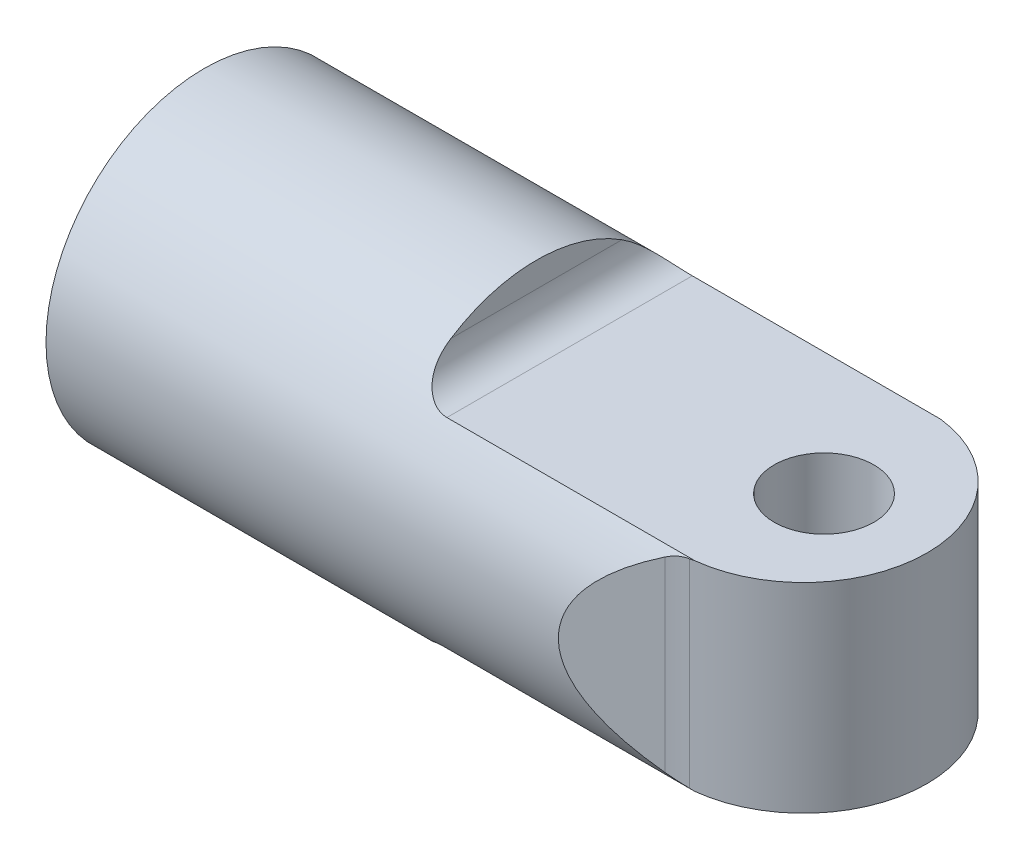
ISO-10303-21;
HEADER;
FILE_DESCRIPTION(('STEP AP214'),'2;1');
FILE_NAME('part.step','',(''),(''),'','','');
FILE_SCHEMA(('AUTOMOTIVE_DESIGN { 1 0 10303 214 1 1 1 1 }'));
ENDSEC;
DATA;
#1=APPLICATION_CONTEXT('core data for automotive mechanical design processes');
#2=APPLICATION_PROTOCOL_DEFINITION('international standard','automotive_design',2000,#1);
#3=PRODUCT_CONTEXT('',#1,'mechanical');
#4=PRODUCT('Part','Part','',(#3));
#5=PRODUCT_RELATED_PRODUCT_CATEGORY('part','',(#4));
#6=PRODUCT_DEFINITION_FORMATION('','',#4);
#7=PRODUCT_DEFINITION_CONTEXT('part definition',#1,'design');
#8=PRODUCT_DEFINITION('design','',#6,#7);
#9=PRODUCT_DEFINITION_SHAPE('','',#8);
#10=(LENGTH_UNIT() NAMED_UNIT(*) SI_UNIT(.MILLI.,.METRE.));
#11=(NAMED_UNIT(*) PLANE_ANGLE_UNIT() SI_UNIT($,.RADIAN.));
#12=(NAMED_UNIT(*) SI_UNIT($,.STERADIAN.) SOLID_ANGLE_UNIT());
#13=UNCERTAINTY_MEASURE_WITH_UNIT(LENGTH_MEASURE(1.E-05),#10,'distance_accuracy_value','');
#14=(GEOMETRIC_REPRESENTATION_CONTEXT(3) GLOBAL_UNCERTAINTY_ASSIGNED_CONTEXT((#13)) GLOBAL_UNIT_ASSIGNED_CONTEXT((#10,
#11,#12)) REPRESENTATION_CONTEXT('',''));
#15=CARTESIAN_POINT('',(0.,0.,0.));
#16=DIRECTION('',(0.,0.,1.));
#17=DIRECTION('',(1.,0.,0.));
#18=AXIS2_PLACEMENT_3D('',#15,#16,#17);
#19=CARTESIAN_POINT('',(-78.7533614327049,-133.755821716633,0.));
#20=DIRECTION('',(0.,1.,0.));
#21=DIRECTION('',(0.,0.,1.));
#22=AXIS2_PLACEMENT_3D('',#19,#20,#21);
#23=CYLINDRICAL_SURFACE('',#22,38.1);
#24=CARTESIAN_POINT('',(-78.7533614327049,-76.4076160114484,0.));
#25=DIRECTION('',(0.,1.,0.));
#26=DIRECTION('',(0.,0.,1.));
#27=AXIS2_PLACEMENT_3D('',#24,#25,#26);
#28=CIRCLE('',#27,38.1);
#29=CARTESIAN_POINT('',(-78.7533614327049,-76.4076160114485,38.1));
#30=VERTEX_POINT('',#29);
#31=EDGE_CURVE('E261',#30,#30,#28,.F.);
#32=ORIENTED_EDGE('',*,*,#31,.T.);
#33=EDGE_LOOP('',(#32));
#34=FACE_BOUND('',#33,.T.);
#35=CARTESIAN_POINT('',(-78.753361432705,76.4076160114479,0.));
#36=DIRECTION('',(0.,1.,0.));
#37=DIRECTION('',(0.,0.,1.));
#38=AXIS2_PLACEMENT_3D('',#35,#36,#37);
#39=CIRCLE('',#38,38.1);
#40=CARTESIAN_POINT('',(-78.753361432705,76.4076160114479,38.1000000000001));
#41=VERTEX_POINT('',#40);
#42=EDGE_CURVE('E19',#41,#41,#39,.T.);
#43=ORIENTED_EDGE('',*,*,#42,.T.);
#44=EDGE_LOOP('',(#43));
#45=FACE_BOUND('',#44,.T.);
#46=ADVANCED_FACE('F16',(#34,#45),#23,.F.);
#47=CARTESIAN_POINT('',(-94.485801667644,122.982158002432,94.4858016676441));
#48=DIRECTION('',(-0.371053816889971,0.,-0.928611363796171));
#49=DIRECTION('',(-0.928611363796171,0.,0.371053816889971));
#50=AXIS2_PLACEMENT_3D('',#47,#48,#49);
#51=PLANE('',#50);
#52=CARTESIAN_POINT('',(141.977442077894,0.,0.));
#53=DIRECTION('',(-0.371053816889971,0.,-0.928611363796171));
#54=DIRECTION('',(-0.928611363796171,0.,0.371053816889971));
#55=AXIS2_PLACEMENT_3D('',#52,#53,#54);
#56=ELLIPSE('',#55,326.155068974868,121.021083241137);
#57=CARTESIAN_POINT('',(-102.560386988729,-71.4032287721533,97.7122382804206));
#58=VERTEX_POINT('',#57);
#59=CARTESIAN_POINT('',(-102.560386988856,71.4032287720838,97.7122382804714));
#60=VERTEX_POINT('',#59);
#61=EDGE_CURVE('E113',#58,#60,#56,.T.);
#62=ORIENTED_EDGE('',*,*,#61,.F.);
#63=DIRECTION('',(0.,-1.,0.));
#64=VECTOR('',#63,1.);
#65=CARTESIAN_POINT('',(-102.560385620926,122.982158002432,97.7122377338751));
#66=LINE('',#65,#64);
#67=EDGE_CURVE('E109',#60,#58,#66,.T.);
#68=ORIENTED_EDGE('',*,*,#67,.F.);
#69=EDGE_LOOP('',(#62,#68));
#70=FACE_BOUND('',#69,.T.);
#71=ADVANCED_FACE('F240',(#70),#51,.F.);
#72=CARTESIAN_POINT('',(-83.7108517229156,76.8513540198977,144.885695014721));
#73=DIRECTION('',(0.,-1.,0.));
#74=DIRECTION('',(0.,0.,-1.));
#75=AXIS2_PLACEMENT_3D('',#72,#73,#74);
#76=CYLINDRICAL_SURFACE('',#75,50.8);
#77=CARTESIAN_POINT('',(-87.4784240785286,-75.944974900852,94.2255983048049));
#78=CARTESIAN_POINT('',(-87.9591413138485,-75.9006257665468,94.2613360229051));
#79=CARTESIAN_POINT('',(-88.4385572819601,-75.8477822609244,94.3038828844457));
#80=CARTESIAN_POINT('',(-89.39384238822,-75.7252672582749,94.4022935245304));
#81=CARTESIAN_POINT('',(-89.8697116555395,-75.6555963772198,94.4581568156211));
#82=CARTESIAN_POINT('',(-90.8169268680687,-75.4995952256391,94.5828927132073));
#83=CARTESIAN_POINT('',(-91.2882734484359,-75.4132673314315,94.6517634640069));
#84=CARTESIAN_POINT('',(-92.2255909509754,-75.2241677058967,94.8021188419887));
#85=CARTESIAN_POINT('',(-92.6915618919484,-75.1213960320988,94.883603425041));
#86=CARTESIAN_POINT('',(-94.0622717602115,-74.7930442517556,95.1429468445752));
#87=CARTESIAN_POINT('',(-94.958347650339,-74.5443546069871,95.3381705767435));
#88=CARTESIAN_POINT('',(-96.7205356721103,-73.9868944374089,95.771427332384));
#89=CARTESIAN_POINT('',(-97.5866583441609,-73.6781453059397,96.0094451102297));
#90=CARTESIAN_POINT('',(-98.7906209236783,-73.1995510972479,96.3740616254773));
#91=CARTESIAN_POINT('',(-99.1428352440458,-73.0533111551811,96.4849841586253));
#92=CARTESIAN_POINT('',(-99.8408804877988,-72.7510186093603,96.7131208459379));
#93=CARTESIAN_POINT('',(-100.186712842788,-72.5949682417619,96.8303335654533));
#94=CARTESIAN_POINT('',(-100.874607878274,-72.2719261711436,97.0716861797085));
#95=CARTESIAN_POINT('',(-101.216615669623,-72.1048546018898,97.1958753779656));
#96=CARTESIAN_POINT('',(-101.89374433525,-71.7611483850489,97.4499145585377));
#97=CARTESIAN_POINT('',(-102.228863893979,-71.5845119336988,97.5797656076692));
#98=CARTESIAN_POINT('',(-102.560388285121,-71.4032280632773,97.7122387984318));
#99=B_SPLINE_CURVE_WITH_KNOTS('',3,(#77,#78,#79,#80,#81,#82,#83,#84,#85,#86,#87,#88,#89,#90,#91,
#92,#93,#94,#95,#96,#97,#98),.UNSPECIFIED.,.F.,.F.,(4,2,2,2,2,2,2,2,2,2,4),(0.,1.45209674884003,
2.90414035121641,4.35597695552534,5.80780848063729,8.65480281851505,11.5007849006894,
12.6921294118824,13.8832033497035,15.0841351813231,16.2852942809736),.UNSPECIFIED.);
#100=CARTESIAN_POINT('',(-87.4780646619713,-75.9420063889409,94.226748249264));
#101=VERTEX_POINT('',#100);
#102=EDGE_CURVE('E107',#101,#58,#99,.T.);
#103=ORIENTED_EDGE('',*,*,#102,.F.);
#104=DIRECTION('',(0.,-1.,0.));
#105=VECTOR('',#104,1.);
#106=CARTESIAN_POINT('',(-87.4783737444027,76.8513540198977,94.2255945626131));
#107=LINE('',#106,#105);
#108=CARTESIAN_POINT('',(-87.4780646619712,75.9420063889409,94.226748249264));
#109=VERTEX_POINT('',#108);
#110=EDGE_CURVE('E93',#101,#109,#107,.F.);
#111=ORIENTED_EDGE('',*,*,#110,.T.);
#112=CARTESIAN_POINT('',(-102.56038828512,71.4032280632772,97.7122387984319));
#113=CARTESIAN_POINT('',(-102.159650652368,71.622363206644,97.5521056677623));
#114=CARTESIAN_POINT('',(-101.75365180511,71.834705991839,97.3958053574022));
#115=CARTESIAN_POINT('',(-100.931527491984,72.2454070592024,97.0915499607565));
#116=CARTESIAN_POINT('',(-100.515401052284,72.4437639893367,96.9435956815704));
#117=CARTESIAN_POINT('',(-99.673076957373,72.8262408670006,96.6566007143807));
#118=CARTESIAN_POINT('',(-99.2468697130204,73.010346483601,96.5175690222146));
#119=CARTESIAN_POINT('',(-98.3853665489854,73.3636870755646,96.2492659236802));
#120=CARTESIAN_POINT('',(-97.9500709876938,73.5329226359512,96.1199941333624));
#121=CARTESIAN_POINT('',(-96.6492306272991,74.0112021646822,95.752828397991));
#122=CARTESIAN_POINT('',(-95.7714169298378,74.2986764412095,95.5296570479446));
#123=CARTESIAN_POINT('',(-93.9887191625616,74.8123935047922,95.1278871893943));
#124=CARTESIAN_POINT('',(-93.0838551162858,75.0386803964948,94.9492565826246));
#125=CARTESIAN_POINT('',(-91.7855077298466,75.3149074781091,94.7300265068767));
#126=CARTESIAN_POINT('',(-91.4006917617102,75.3908660861876,94.6695725403067));
#127=CARTESIAN_POINT('',(-90.6278150046957,75.5316422087525,94.5572935368821));
#128=CARTESIAN_POINT('',(-90.2397547356426,75.5964614735007,94.5054671444659));
#129=CARTESIAN_POINT('',(-89.4575006600138,75.7153682659288,94.4102297611909));
#130=CARTESIAN_POINT('',(-89.0632828133874,75.7693585454265,94.366895102514));
#131=CARTESIAN_POINT('',(-88.2724807178992,75.8658268432016,94.2893555427669));
#132=CARTESIAN_POINT('',(-87.8758960863949,75.9083029454348,94.2551521612231));
#133=CARTESIAN_POINT('',(-87.4784240784264,75.9449749012491,94.2255983059104));
#134=B_SPLINE_CURVE_WITH_KNOTS('',3,(#112,#113,#114,#115,#116,#117,#118,#119,#120,#121,#122,
#123,#124,#125,#126,#127,#128,#129,#130,#131,#132,#133),.UNSPECIFIED.,.F.,.F.,(4,2,2,2,2,2,2,2,
2,2,4),(0.,1.45191794594972,2.90397605915543,4.35747586915737,5.81091846938353,8.65823789429381,
11.5034994305381,12.6939127911857,13.8841389375927,15.0846172244154,16.2852951572362),.UNSPECIFIED.);
#135=EDGE_CURVE('E249',#60,#109,#134,.T.);
#136=ORIENTED_EDGE('',*,*,#135,.F.);
#137=ORIENTED_EDGE('',*,*,#67,.T.);
#138=EDGE_LOOP('',(#103,#111,#136,#137));
#139=FACE_BOUND('',#138,.T.);
#140=ADVANCED_FACE('F108',(#139),#76,.F.);
#141=CARTESIAN_POINT('',(-298.708582290545,127.239678051438,-128.982810471636));
#142=DIRECTION('',(-1.,0.,0.));
#143=DIRECTION('',(0.,-1.,0.));
#144=AXIS2_PLACEMENT_3D('',#141,#142,#143);
#145=PLANE('',#144);
#146=DIRECTION('',(0.,0.,-1.));
#147=VECTOR('',#146,1.);
#148=CARTESIAN_POINT('',(-298.708582290545,101.807616011448,-128.982810471636));
#149=LINE('',#148,#147);
#150=CARTESIAN_POINT('',(-298.708582290545,101.807616011448,65.4317347387616));
#151=VERTEX_POINT('',#150);
#152=CARTESIAN_POINT('',(-298.708582290545,101.807616011448,-65.4317347387619));
#153=VERTEX_POINT('',#152);
#154=EDGE_CURVE('E265',#151,#153,#149,.T.);
#155=ORIENTED_EDGE('',*,*,#154,.T.);
#156=CARTESIAN_POINT('',(-298.708582290545,0.,0.));
#157=DIRECTION('',(-1.,0.,0.));
#158=DIRECTION('',(0.,-1.,0.));
#159=AXIS2_PLACEMENT_3D('',#156,#157,#158);
#160=CIRCLE('',#159,121.021083241137);
#161=EDGE_CURVE('E253',#151,#153,#160,.T.);
#162=ORIENTED_EDGE('',*,*,#161,.F.);
#163=EDGE_LOOP('',(#155,#162));
#164=FACE_BOUND('',#163,.T.);
#165=ADVANCED_FACE('F233',(#164),#145,.F.);
#166=CARTESIAN_POINT('',(-273.308582290545,101.807616011448,-128.982810471636));
#167=DIRECTION('',(0.,0.,-1.));
#168=DIRECTION('',(0.,1.,0.));
#169=AXIS2_PLACEMENT_3D('',#166,#167,#168);
#170=CYLINDRICAL_SURFACE('',#169,25.4);
#171=DIRECTION('',(0.,0.,-1.));
#172=VECTOR('',#171,1.);
#173=CARTESIAN_POINT('',(-273.308582290545,76.4076160114481,-128.982810471636));
#174=LINE('',#173,#172);
#175=CARTESIAN_POINT('',(-273.308582290545,76.4076160114484,93.8508327310164));
#176=VERTEX_POINT('',#175);
#177=CARTESIAN_POINT('',(-273.308582290545,76.4076160114481,-93.8508327310166));
#178=VERTEX_POINT('',#177);
#179=EDGE_CURVE('E263',#176,#178,#174,.T.);
#180=ORIENTED_EDGE('',*,*,#179,.T.);
#181=CARTESIAN_POINT('',(-298.708582290545,101.807616011448,-65.4317347387618));
#182=CARTESIAN_POINT('',(-298.708553295663,101.362039777198,-66.1250504055652));
#183=CARTESIAN_POINT('',(-298.696854430139,100.909313064868,-66.8138666988336));
#184=CARTESIAN_POINT('',(-298.647667865774,99.9901907666376,-68.1816877285484));
#185=CARTESIAN_POINT('',(-298.610171964879,99.5237908785789,-68.860689274315));
#186=CARTESIAN_POINT('',(-298.506688220139,98.5759404299829,-70.2108995881486));
#187=CARTESIAN_POINT('',(-298.440562752541,98.094427724943,-70.8820544258446));
#188=CARTESIAN_POINT('',(-298.277108670187,97.1196606727773,-72.2118659429244));
#189=CARTESIAN_POINT('',(-298.179782944182,96.6264074165912,-72.870523773396));
#190=CARTESIAN_POINT('',(-297.949330065795,95.6218978773581,-74.1838866379355));
#191=CARTESIAN_POINT('',(-297.815680220376,95.1104818186196,-74.8383786843259));
#192=CARTESIAN_POINT('',(-297.510101610844,94.0787110533906,-76.1313522416565));
#193=CARTESIAN_POINT('',(-297.338169343638,93.5583555329046,-76.7698322814404));
#194=CARTESIAN_POINT('',(-296.953127554107,92.5121590730919,-78.0273703835272));
#195=CARTESIAN_POINT('',(-296.740104341319,91.9863317795471,-78.6464660480018));
#196=CARTESIAN_POINT('',(-296.269336262037,90.9311533730512,-79.864113980488));
#197=CARTESIAN_POINT('',(-296.011603148997,90.4018032212798,-80.4626715981846));
#198=CARTESIAN_POINT('',(-295.450783090263,89.3482631676742,-81.6308941350272));
#199=CARTESIAN_POINT('',(-295.148171568464,88.8240741836223,-82.2007868188502));
#200=CARTESIAN_POINT('',(-294.492565328531,87.7798227150583,-83.3149947720718));
#201=CARTESIAN_POINT('',(-294.13956706132,87.2597605239501,-83.8593082361616));
#202=CARTESIAN_POINT('',(-293.381865034104,86.2310477169368,-84.9167262725819));
#203=CARTESIAN_POINT('',(-292.977390337051,85.7223576215602,-85.4299550768628));
#204=CARTESIAN_POINT('',(-292.329469593399,84.9708930746832,-86.1752556926351));
#205=CARTESIAN_POINT('',(-292.10663856995,84.7223439699595,-86.4195886238046));
#206=CARTESIAN_POINT('',(-291.646925211521,84.2298262371915,-86.8996963323589));
#207=CARTESIAN_POINT('',(-291.410039210303,83.9858588263237,-87.1354688506797));
#208=CARTESIAN_POINT('',(-290.750233010766,83.3335635361514,-87.760718545422));
#209=CARTESIAN_POINT('',(-290.313771487769,82.9304670711565,-88.1415242702583));
#210=CARTESIAN_POINT('',(-289.399441423806,82.1452840919702,-88.8737483288823));
#211=CARTESIAN_POINT('',(-288.92158163429,81.7631931650621,-89.2251728430383));
#212=CARTESIAN_POINT('',(-287.924688322623,81.025072424224,-89.8959898985018));
#213=CARTESIAN_POINT('',(-287.405647169774,80.6690474637947,-90.2153764784008));
#214=CARTESIAN_POINT('',(-286.327885895314,79.9887339793915,-90.8191164151133));
#215=CARTESIAN_POINT('',(-285.769172267049,79.6644402824072,-91.1034754842735));
#216=CARTESIAN_POINT('',(-284.702656675659,79.0998733417904,-91.5938338730953));
#217=CARTESIAN_POINT('',(-284.20009006539,78.8543295573354,-91.8051695222732));
#218=CARTESIAN_POINT('',(-283.170366861765,78.3934477499004,-92.1990339279871));
#219=CARTESIAN_POINT('',(-282.643211413362,78.1781083223538,-92.3815640240917));
#220=CARTESIAN_POINT('',(-281.567750469749,77.7810821431823,-92.716089296299));
#221=CARTESIAN_POINT('',(-281.01947128259,77.5993550688267,-92.8681210781789));
#222=CARTESIAN_POINT('',(-279.904576091401,77.2721275619151,-93.1405728670207));
#223=CARTESIAN_POINT('',(-279.337963178696,77.1266210576595,-93.2609981724001));
#224=CARTESIAN_POINT('',(-278.321638708202,76.9031035870267,-93.445337371712));
#225=CARTESIAN_POINT('',(-277.874823996466,76.8172669432001,-93.5158766997475));
#226=CARTESIAN_POINT('',(-276.974670818573,76.669442869871,-93.6371095607308));
#227=CARTESIAN_POINT('',(-276.521333566468,76.6074510601666,-93.6878067386334));
#228=CARTESIAN_POINT('',(-275.60927668063,76.5078609876929,-93.7691525134342));
#229=CARTESIAN_POINT('',(-275.150548411725,76.4703096010725,-93.799762584663));
#230=CARTESIAN_POINT('',(-274.460766093168,76.4327155025007,-93.8303938628335));
#231=CARTESIAN_POINT('',(-274.230505165862,76.4233062921752,-93.8380569873293));
#232=CARTESIAN_POINT('',(-273.769696669172,76.4107559140037,-93.848276518847));
#233=CARTESIAN_POINT('',(-273.539149096439,76.4076148200792,-93.8508328656436));
#234=CARTESIAN_POINT('',(-273.308582290545,76.4076160114481,-93.8508327310166));
#235=B_SPLINE_CURVE_WITH_KNOTS('',3,(#181,#182,#183,#184,#185,#186,#187,#188,#189,#190,#191,
#192,#193,#194,#195,#196,#197,#198,#199,#200,#201,#202,#203,#204,#205,#206,#207,#208,#209,#210,
#211,#212,#213,#214,#215,#216,#217,#218,#219,#220,#221,#222,#223,#224,#225,#226,#227,#228,#229,
#230,#231,#232,#233,#234),.UNSPECIFIED.,.F.,.F.,(4,2,2,2,2,2,2,2,2,2,2,2,2,2,2,2,2,2,2,2,2,2,2,
2,2,2,4),(0.,2.47244767678368,4.94568182082443,7.43093927239429,9.91596668686305,
12.4388419995297,14.9619482667477,17.4798114720274,19.9970137751915,22.4892378856576,
24.9816376268872,27.4633108342745,28.7040386346589,29.9450915136756,32.0600328469734,
34.174528174926,36.2894162272692,38.403958922113,40.1959312811609,41.987820282047,
43.7775455173895,45.5669705365047,46.9472013543143,48.3271785079403,49.7097946855419,
50.401413092254,51.0930396553331),.UNSPECIFIED.);
#236=EDGE_CURVE('E154',#153,#178,#235,.T.);
#237=ORIENTED_EDGE('',*,*,#236,.F.);
#238=ORIENTED_EDGE('',*,*,#154,.F.);
#239=CARTESIAN_POINT('',(-273.308582290545,76.4076160114484,93.8508327310164));
#240=CARTESIAN_POINT('',(-273.603081038692,76.40761299536,93.8508329641864));
#241=CARTESIAN_POINT('',(-273.897539126936,76.4127391461998,93.8466620644234));
#242=CARTESIAN_POINT('',(-274.48585216948,76.4332064606894,93.8299940944429));
#243=CARTESIAN_POINT('',(-274.779707147867,76.4485472080828,93.8174973635127));
#244=CARTESIAN_POINT('',(-275.659261599661,76.5098019831983,93.7675624464351));
#245=CARTESIAN_POINT('',(-276.243312472323,76.5709486533712,93.7176794910539));
#246=CARTESIAN_POINT('',(-277.399036216295,76.7323882007583,93.5855432953099));
#247=CARTESIAN_POINT('',(-277.970757506843,76.8324768316122,93.5034589295498));
#248=CARTESIAN_POINT('',(-279.100868156554,77.0701386490444,93.30766307369));
#249=CARTESIAN_POINT('',(-279.659256860031,77.2077136750606,93.193950031582));
#250=CARTESIAN_POINT('',(-280.758169428881,77.5179205068891,92.9360810827387));
#251=CARTESIAN_POINT('',(-281.298714293842,77.6905092623254,92.7919625518095));
#252=CARTESIAN_POINT('',(-282.359512241968,78.0682476767616,92.4743862337378));
#253=CARTESIAN_POINT('',(-282.879763581674,78.2734001257336,92.3009259325854));
#254=CARTESIAN_POINT('',(-283.642974860045,78.6033627014609,92.0197525114579));
#255=CARTESIAN_POINT('',(-283.894672040599,78.7171352063467,91.9224624123145));
#256=CARTESIAN_POINT('',(-284.391941017831,78.9516605815279,91.7211086437738));
#257=CARTESIAN_POINT('',(-284.637514443951,79.0724115659586,91.6170468034233));
#258=CARTESIAN_POINT('',(-285.364812617127,79.4446140063685,91.2949260979241));
#259=CARTESIAN_POINT('',(-285.837128186459,79.7060205667131,91.0669272764397));
#260=CARTESIAN_POINT('',(-286.778727543037,80.2662413323865,90.5736137162794));
#261=CARTESIAN_POINT('',(-287.246574418789,80.5662943063451,90.3069745069433));
#262=CARTESIAN_POINT('',(-288.151335452718,81.1883512355863,89.7481420575206));
#263=CARTESIAN_POINT('',(-288.58824933761,81.5103553847538,89.4559485917183));
#264=CARTESIAN_POINT('',(-289.430267689676,82.1724954839315,88.8481026443759));
#265=CARTESIAN_POINT('',(-289.835391377403,82.5126202659362,88.5324645658624));
#266=CARTESIAN_POINT('',(-290.614078807363,83.2078219094289,87.879398416021));
#267=CARTESIAN_POINT('',(-290.987635913863,83.562901891317,87.5419657893494));
#268=CARTESIAN_POINT('',(-291.889358492795,84.4723592623864,86.666611283029));
#269=CARTESIAN_POINT('',(-292.397084660988,85.0344842243164,86.1155647895054));
#270=CARTESIAN_POINT('',(-293.34276597524,86.1761889173559,84.9730548155954));
#271=CARTESIAN_POINT('',(-293.780690594586,86.7557761543101,84.3815738124505));
#272=CARTESIAN_POINT('',(-294.592774722838,87.9276158402001,83.1598328407098));
#273=CARTESIAN_POINT('',(-294.966528991863,88.5199239786689,82.5293583396955));
#274=CARTESIAN_POINT('',(-295.651371606911,89.7068218763551,81.2376634240358));
#275=CARTESIAN_POINT('',(-295.962468035352,90.3014113312025,80.5764469884439));
#276=CARTESIAN_POINT('',(-296.476106284005,91.3809155588567,79.3484361749662));
#277=CARTESIAN_POINT('',(-296.688109829912,91.866351808291,78.7860076620069));
#278=CARTESIAN_POINT('',(-297.07586002171,92.8327824988531,77.6449360211718));
#279=CARTESIAN_POINT('',(-297.251600892177,93.313776220801,77.0662903270882));
#280=CARTESIAN_POINT('',(-297.569589810285,94.2698661685469,75.8937942200645));
#281=CARTESIAN_POINT('',(-297.711792286861,94.7449535485996,75.2999243210919));
#282=CARTESIAN_POINT('',(-297.964931818672,95.6869701159928,74.099181448789));
#283=CARTESIAN_POINT('',(-298.075867169254,96.1538988572307,73.4923077684448));
#284=CARTESIAN_POINT('',(-298.267169624504,97.0701011908938,72.2777040403788));
#285=CARTESIAN_POINT('',(-298.348041603068,97.5195409336226,71.6701780814507));
#286=CARTESIAN_POINT('',(-298.484100193379,98.4082946990197,70.4448935321954));
#287=CARTESIAN_POINT('',(-298.53928511385,98.8476080531414,69.8271342708641));
#288=CARTESIAN_POINT('',(-298.625864451481,99.7137921852255,68.5845007115305));
#289=CARTESIAN_POINT('',(-298.657339785021,100.140700458327,67.9596580686212));
#290=CARTESIAN_POINT('',(-298.698685893533,100.982950800582,66.7017219162888));
#291=CARTESIAN_POINT('',(-298.708561739758,101.398295562069,66.068630378712));
#292=CARTESIAN_POINT('',(-298.708582290545,101.807616011448,65.4317347387617));
#293=B_SPLINE_CURVE_WITH_KNOTS('',3,(#239,#240,#241,#242,#243,#244,#245,#246,#247,#248,#249,
#250,#251,#252,#253,#254,#255,#256,#257,#258,#259,#260,#261,#262,#263,#264,#265,#266,#267,#268,
#269,#270,#271,#272,#273,#274,#275,#276,#277,#278,#279,#280,#281,#282,#283,#284,#285,#286,#287,
#288,#289,#290,#291,#292),.UNSPECIFIED.,.F.,.F.,(4,2,2,2,2,2,2,2,2,2,2,2,2,2,2,2,2,2,2,2,2,2,2,
2,2,2,4),(0.,0.883341381448317,1.76664676792536,3.53217582577983,5.28856706385273,
7.04504450265367,8.7993752504606,10.5538563859529,11.4322132686715,12.3103338841536,
14.0665305950196,15.9141208146322,17.7617273553004,19.6082080738518,21.4550759876611,
24.2609381476654,27.0680240643292,29.8922322923756,32.7160759838436,35.0328409707771,
37.349974656045,39.6702388911982,41.9906296005544,44.2700738402254,46.549668140821,
48.8214469188083,51.0926922580234),.UNSPECIFIED.);
#294=EDGE_CURVE('E164',#176,#151,#293,.T.);
#295=ORIENTED_EDGE('',*,*,#294,.F.);
#296=EDGE_LOOP('',(#180,#237,#238,#295));
#297=FACE_BOUND('',#296,.T.);
#298=ADVANCED_FACE('F228',(#297),#170,.F.);
#299=CARTESIAN_POINT('',(-273.308582290545,76.4076160114481,-128.982810471636));
#300=DIRECTION('',(0.,-1.,0.));
#301=DIRECTION('',(0.,0.,-1.));
#302=AXIS2_PLACEMENT_3D('',#299,#300,#301);
#303=PLANE('',#302);
#304=ORIENTED_EDGE('',*,*,#42,.F.);
#305=EDGE_LOOP('',(#304));
#306=FACE_BOUND('',#305,.T.);
#307=DIRECTION('',(-1.,0.,0.));
#308=VECTOR('',#307,1.);
#309=CARTESIAN_POINT('',(-298.708582290546,76.4076160114481,-93.8508327310166));
#310=LINE('',#309,#308);
#311=CARTESIAN_POINT('',(-83.5501758294894,76.4076160114484,-93.8508327310166));
#312=VERTEX_POINT('',#311);
#313=EDGE_CURVE('E255',#178,#312,#310,.F.);
#314=ORIENTED_EDGE('',*,*,#313,.F.);
#315=ORIENTED_EDGE('',*,*,#179,.F.);
#316=DIRECTION('',(-1.,0.,0.));
#317=VECTOR('',#316,1.);
#318=CARTESIAN_POINT('',(-298.708582290546,76.4076160114484,93.8508327310163));
#319=LINE('',#318,#317);
#320=CARTESIAN_POINT('',(-83.5501758294871,76.4076160114484,93.8508327310163));
#321=VERTEX_POINT('',#320);
#322=EDGE_CURVE('E250',#321,#176,#319,.T.);
#323=ORIENTED_EDGE('',*,*,#322,.F.);
#324=CARTESIAN_POINT('',(-94.4858016676441,76.4076160114485,0.));
#325=DIRECTION('',(0.,-1.,0.));
#326=DIRECTION('',(0.,0.,-1.));
#327=AXIS2_PLACEMENT_3D('',#324,#325,#326);
#328=CIRCLE('',#327,94.4858016676441);
#329=EDGE_CURVE('E85',#321,#312,#328,.F.);
#330=ORIENTED_EDGE('',*,*,#329,.T.);
#331=EDGE_LOOP('',(#314,#315,#323,#330));
#332=FACE_BOUND('',#331,.T.);
#333=ADVANCED_FACE('F225',(#306,#332),#303,.F.);
#334=CARTESIAN_POINT('',(-167.800518605271,122.982158002432,-123.780840059922));
#335=DIRECTION('',(-0.371053816889971,0.,0.92861136379617));
#336=DIRECTION('',(0.92861136379617,0.,0.371053816889971));
#337=AXIS2_PLACEMENT_3D('',#334,#335,#336);
#338=PLANE('',#337);
#339=CARTESIAN_POINT('',(141.977442077894,0.,0.));
#340=DIRECTION('',(-0.371053816889971,0.,0.92861136379617));
#341=DIRECTION('',(-0.92861136379617,0.,-0.371053816889971));
#342=AXIS2_PLACEMENT_3D('',#339,#340,#341);
#343=ELLIPSE('',#342,326.155068974868,121.021083241137);
#344=CARTESIAN_POINT('',(-102.560386988729,71.4032287721531,-97.7122382804207));
#345=VERTEX_POINT('',#344);
#346=CARTESIAN_POINT('',(-102.560386988856,-71.4032287720837,-97.7122382804714));
#347=VERTEX_POINT('',#346);
#348=EDGE_CURVE('E276',#345,#347,#343,.T.);
#349=ORIENTED_EDGE('',*,*,#348,.F.);
#350=DIRECTION('',(0.,-1.,0.));
#351=VECTOR('',#350,1.);
#352=CARTESIAN_POINT('',(-102.560385620926,122.982158002432,-97.712237733875));
#353=LINE('',#352,#351);
#354=EDGE_CURVE('E104',#347,#345,#353,.F.);
#355=ORIENTED_EDGE('',*,*,#354,.F.);
#356=EDGE_LOOP('',(#349,#355));
#357=FACE_BOUND('',#356,.T.);
#358=ADVANCED_FACE('F220',(#357),#338,.F.);
#359=CARTESIAN_POINT('',(-83.7108517229152,76.8513540198979,-144.88569501472));
#360=DIRECTION('',(0.,-1.,0.));
#361=DIRECTION('',(0.,0.,-1.));
#362=AXIS2_PLACEMENT_3D('',#359,#360,#361);
#363=CYLINDRICAL_SURFACE('',#362,50.8);
#364=CARTESIAN_POINT('',(-102.56038828512,-71.4032280632771,-97.712238798432));
#365=CARTESIAN_POINT('',(-102.159650652368,-71.6223632066439,-97.5521056677624));
#366=CARTESIAN_POINT('',(-101.75365180511,-71.8347059918388,-97.3958053574023));
#367=CARTESIAN_POINT('',(-100.931527491984,-72.2454070592023,-97.0915499607566));
#368=CARTESIAN_POINT('',(-100.515401052284,-72.4437639893366,-96.9435956815706));
#369=CARTESIAN_POINT('',(-99.673076957373,-72.8262408670005,-96.6566007143808));
#370=CARTESIAN_POINT('',(-99.2468697130204,-73.0103464836009,-96.5175690222147));
#371=CARTESIAN_POINT('',(-98.3853665489854,-73.3636870755645,-96.2492659236803));
#372=CARTESIAN_POINT('',(-97.9500709876938,-73.5329226359512,-96.1199941333625));
#373=CARTESIAN_POINT('',(-96.649230627299,-74.0112021646822,-95.7528283979911));
#374=CARTESIAN_POINT('',(-95.7714169298377,-74.2986764412094,-95.5296570479447));
#375=CARTESIAN_POINT('',(-93.9887191625616,-74.8123935047921,-95.1278871893944));
#376=CARTESIAN_POINT('',(-93.0838551162858,-75.0386803964949,-94.9492565826247));
#377=CARTESIAN_POINT('',(-91.7855077298466,-75.3149074781091,-94.7300265068768));
#378=CARTESIAN_POINT('',(-91.4006917617102,-75.3908660861876,-94.6695725403067));
#379=CARTESIAN_POINT('',(-90.6278150046956,-75.5316422087525,-94.5572935368821));
#380=CARTESIAN_POINT('',(-90.2397547356425,-75.5964614735007,-94.505467144466));
#381=CARTESIAN_POINT('',(-89.4575006600136,-75.7153682659288,-94.4102297611909));
#382=CARTESIAN_POINT('',(-89.0632828133873,-75.7693585454265,-94.366895102514));
#383=CARTESIAN_POINT('',(-88.272480717899,-75.8658268432017,-94.2893555427669));
#384=CARTESIAN_POINT('',(-87.8758960863947,-75.9083029454348,-94.2551521612231));
#385=CARTESIAN_POINT('',(-87.4784240784262,-75.9449749012491,-94.2255983059104));
#386=B_SPLINE_CURVE_WITH_KNOTS('',3,(#364,#365,#366,#367,#368,#369,#370,#371,#372,#373,#374,
#375,#376,#377,#378,#379,#380,#381,#382,#383,#384,#385),.UNSPECIFIED.,.F.,.F.,(4,2,2,2,2,2,2,2,
2,2,4),(0.,1.4519179459497,2.90397605915542,4.35747586915735,5.81091846938355,8.65823789429383,
11.5034994305381,12.6939127911858,13.8841389375928,15.0846172244155,16.2852951572365),.UNSPECIFIED.);
#387=CARTESIAN_POINT('',(-87.478064661971,-75.9420063889406,-94.2267482492641));
#388=VERTEX_POINT('',#387);
#389=EDGE_CURVE('E273',#347,#388,#386,.T.);
#390=ORIENTED_EDGE('',*,*,#389,.F.);
#391=ORIENTED_EDGE('',*,*,#354,.T.);
#392=CARTESIAN_POINT('',(-87.4784240785282,75.944974900852,-94.2255983048048));
#393=CARTESIAN_POINT('',(-87.9591413138481,75.9006257665468,-94.2613360229051));
#394=CARTESIAN_POINT('',(-88.4385572819596,75.8477822609244,-94.3038828844456));
#395=CARTESIAN_POINT('',(-89.3938423882196,75.7252672582749,-94.4022935245304));
#396=CARTESIAN_POINT('',(-89.8697116555391,75.6555963772198,-94.458156815621));
#397=CARTESIAN_POINT('',(-90.8169268680683,75.4995952256391,-94.5828927132073));
#398=CARTESIAN_POINT('',(-91.2882734484355,75.4132673314315,-94.6517634640069));
#399=CARTESIAN_POINT('',(-92.225590950975,75.2241677058967,-94.8021188419887));
#400=CARTESIAN_POINT('',(-92.691561891948,75.1213960320988,-94.8836034250409));
#401=CARTESIAN_POINT('',(-94.0622717602111,74.7930442517555,-95.1429468445752));
#402=CARTESIAN_POINT('',(-94.9583476503386,74.5443546069871,-95.3381705767435));
#403=CARTESIAN_POINT('',(-96.7205356721099,73.9868944374088,-95.771427332384));
#404=CARTESIAN_POINT('',(-97.5866583441605,73.6781453059397,-96.0094451102297));
#405=CARTESIAN_POINT('',(-98.7906209236779,73.1995510972479,-96.3740616254773));
#406=CARTESIAN_POINT('',(-99.1428352440454,73.0533111551811,-96.4849841586253));
#407=CARTESIAN_POINT('',(-99.8408804877984,72.7510186093603,-96.7131208459379));
#408=CARTESIAN_POINT('',(-100.186712842788,72.5949682417619,-96.8303335654533));
#409=CARTESIAN_POINT('',(-100.874607878273,72.2719261711435,-97.0716861797085));
#410=CARTESIAN_POINT('',(-101.216615669622,72.1048546018898,-97.1958753779656));
#411=CARTESIAN_POINT('',(-101.89374433525,71.7611483850489,-97.4499145585377));
#412=CARTESIAN_POINT('',(-102.228863893979,71.5845119336987,-97.5797656076692));
#413=CARTESIAN_POINT('',(-102.56038828512,71.4032280632773,-97.7122387984318));
#414=B_SPLINE_CURVE_WITH_KNOTS('',3,(#392,#393,#394,#395,#396,#397,#398,#399,#400,#401,#402,
#403,#404,#405,#406,#407,#408,#409,#410,#411,#412,#413),.UNSPECIFIED.,.F.,.F.,(4,2,2,2,2,2,2,2,
2,2,4),(0.,1.45209674884002,2.9041403512164,4.35597695552533,5.80780848063731,8.65480281851506,
11.5007849006894,12.6921294118825,13.8832033497035,15.0841351813231,16.2852942809736),.UNSPECIFIED.);
#415=CARTESIAN_POINT('',(-87.4780646619709,75.942006388941,-94.2267482492639));
#416=VERTEX_POINT('',#415);
#417=EDGE_CURVE('E214',#416,#345,#414,.T.);
#418=ORIENTED_EDGE('',*,*,#417,.F.);
#419=DIRECTION('',(0.,-1.,0.));
#420=VECTOR('',#419,1.);
#421=CARTESIAN_POINT('',(-87.4783737444023,76.8513540198978,-94.225594562613));
#422=LINE('',#421,#420);
#423=EDGE_CURVE('E291',#416,#388,#422,.T.);
#424=ORIENTED_EDGE('',*,*,#423,.T.);
#425=EDGE_LOOP('',(#390,#391,#418,#424));
#426=FACE_BOUND('',#425,.T.);
#427=ADVANCED_FACE('F216',(#426),#363,.F.);
#428=CARTESIAN_POINT('',(-94.4858016676441,76.4076160114485,0.));
#429=DIRECTION('',(0.,-1.,0.));
#430=DIRECTION('',(0.,0.,-1.));
#431=AXIS2_PLACEMENT_3D('',#428,#429,#430);
#432=CYLINDRICAL_SURFACE('',#431,94.4858016676441);
#433=CARTESIAN_POINT('',(-83.5501758294893,76.4076160114481,-93.8508327310165));
#434=CARTESIAN_POINT('',(-83.8758679861196,76.3610013675165,-93.8887831701195));
#435=CARTESIAN_POINT('',(-84.2020372503745,76.3163599413262,-93.9250701002567));
#436=CARTESIAN_POINT('',(-84.8551690323503,76.2310972589999,-93.9942840311323));
#437=CARTESIAN_POINT('',(-85.1821313213147,76.1904749587214,-94.0272119046011));
#438=CARTESIAN_POINT('',(-85.8368583186829,76.1132998691389,-94.089694641879));
#439=CARTESIAN_POINT('',(-86.164623028009,76.0767470845149,-94.1192495018092));
#440=CARTESIAN_POINT('',(-86.8209595034618,76.0077568909262,-94.1749724116276));
#441=CARTESIAN_POINT('',(-87.149531457614,75.9753205566895,-94.2011395770881));
#442=CARTESIAN_POINT('',(-87.4784241107911,75.9449748983109,-94.2255983082786));
#443=B_SPLINE_CURVE_WITH_KNOTS('',3,(#433,#434,#435,#436,#437,#438,#439,#440,#441,#442),
.UNSPECIFIED.,.F.,.F.,(4,2,2,2,4),(0.,0.993568639952637,1.98687847575063,2.98018945381567,
3.97375923550903),.UNSPECIFIED.);
#444=EDGE_CURVE('E215',#312,#416,#443,.T.);
#445=ORIENTED_EDGE('',*,*,#444,.F.);
#446=ORIENTED_EDGE('',*,*,#329,.F.);
#447=CARTESIAN_POINT('',(-87.4784241107914,75.9449748983108,94.2255983082787));
#448=CARTESIAN_POINT('',(-87.1495314576141,75.9753205566894,94.2011395770882));
#449=CARTESIAN_POINT('',(-86.8209595034617,76.0077568909262,94.1749724116276));
#450=CARTESIAN_POINT('',(-86.1646230280086,76.0767470845148,94.1192495018092));
#451=CARTESIAN_POINT('',(-85.8368583186823,76.1132998691389,94.089694641879));
#452=CARTESIAN_POINT('',(-85.1821313213137,76.1904749587214,94.0272119046011));
#453=CARTESIAN_POINT('',(-84.8551690323491,76.231097259,93.9942840311323));
#454=CARTESIAN_POINT('',(-84.2020372503728,76.3163599413264,93.9250701002566));
#455=CARTESIAN_POINT('',(-83.8758679861178,76.3610013675167,93.8887831701194));
#456=CARTESIAN_POINT('',(-83.5501758294873,76.4076160114483,93.8508327310164));
#457=B_SPLINE_CURVE_WITH_KNOTS('',3,(#447,#448,#449,#450,#451,#452,#453,#454,#455,#456),
.UNSPECIFIED.,.F.,.F.,(4,2,2,2,4),(0.,0.993569781693905,1.98688075975955,2.98019059555812,
3.97375923551135),.UNSPECIFIED.);
#458=EDGE_CURVE('E102',#109,#321,#457,.T.);
#459=ORIENTED_EDGE('',*,*,#458,.F.);
#460=ORIENTED_EDGE('',*,*,#110,.F.);
#461=CARTESIAN_POINT('',(-83.5501758294877,-76.4076160114485,93.8508327310163));
#462=CARTESIAN_POINT('',(-83.8758679861181,-76.3610013675169,93.8887831701193));
#463=CARTESIAN_POINT('',(-84.2020372503731,-76.3163599413265,93.9250701002565));
#464=CARTESIAN_POINT('',(-84.8551690323494,-76.2310972590002,93.9942840311322));
#465=CARTESIAN_POINT('',(-85.1821313213139,-76.1904749587216,94.0272119046009));
#466=CARTESIAN_POINT('',(-85.8368583186825,-76.1132998691391,94.0896946418789));
#467=CARTESIAN_POINT('',(-86.1646230280088,-76.076747084515,94.1192495018091));
#468=CARTESIAN_POINT('',(-86.8209595034618,-76.0077568909264,94.1749724116275));
#469=CARTESIAN_POINT('',(-87.1495314576142,-75.9753205566896,94.2011395770881));
#470=CARTESIAN_POINT('',(-87.4784241107916,-75.944974898311,94.2255983082786));
#471=B_SPLINE_CURVE_WITH_KNOTS('',3,(#461,#462,#463,#464,#465,#466,#467,#468,#469,#470),
.UNSPECIFIED.,.F.,.F.,(4,2,2,2,4),(0.,0.993568639953175,1.9868784757517,2.98018945381729,
3.97375923551116),.UNSPECIFIED.);
#472=CARTESIAN_POINT('',(-83.5501758294877,-76.4076160114485,93.8508327310163));
#473=VERTEX_POINT('',#472);
#474=EDGE_CURVE('E99',#473,#101,#471,.T.);
#475=ORIENTED_EDGE('',*,*,#474,.F.);
#476=CARTESIAN_POINT('',(-94.4858016676442,-76.4076160114484,-1.0112043712199E-13));
#477=DIRECTION('',(0.,-1.,0.));
#478=DIRECTION('',(0.,0.,-1.));
#479=AXIS2_PLACEMENT_3D('',#476,#477,#478);
#480=CIRCLE('',#479,94.4858016676441);
#481=CARTESIAN_POINT('',(-83.5501758294871,-76.4076160114483,-93.8508327310164));
#482=VERTEX_POINT('',#481);
#483=EDGE_CURVE('E295',#473,#482,#480,.F.);
#484=ORIENTED_EDGE('',*,*,#483,.T.);
#485=CARTESIAN_POINT('',(-87.4784241107912,-75.9449748983108,-94.2255983082787));
#486=CARTESIAN_POINT('',(-87.1495314576138,-75.9753205566894,-94.2011395770882));
#487=CARTESIAN_POINT('',(-86.8209595034614,-76.0077568909262,-94.1749724116277));
#488=CARTESIAN_POINT('',(-86.1646230280082,-76.0767470845149,-94.1192495018093));
#489=CARTESIAN_POINT('',(-85.8368583186819,-76.113299869139,-94.089694641879));
#490=CARTESIAN_POINT('',(-85.1821313213132,-76.1904749587215,-94.0272119046011));
#491=CARTESIAN_POINT('',(-84.8551690323485,-76.2310972590001,-93.9942840311323));
#492=CARTESIAN_POINT('',(-84.2020372503722,-76.3163599413265,-93.9250701002566));
#493=CARTESIAN_POINT('',(-83.8758679861171,-76.3610013675168,-93.8887831701194));
#494=CARTESIAN_POINT('',(-83.5501758294866,-76.4076160114484,-93.8508327310163));
#495=B_SPLINE_CURVE_WITH_KNOTS('',3,(#485,#486,#487,#488,#489,#490,#491,#492,#493,#494),
.UNSPECIFIED.,.F.,.F.,(4,2,2,2,4),(0.,0.99356978169405,1.98688075975982,2.98019059555855,
3.97375923551191),.UNSPECIFIED.);
#496=EDGE_CURVE('E270',#388,#482,#495,.T.);
#497=ORIENTED_EDGE('',*,*,#496,.F.);
#498=ORIENTED_EDGE('',*,*,#423,.F.);
#499=EDGE_LOOP('',(#445,#446,#459,#460,#475,#484,#497,#498));
#500=FACE_BOUND('',#499,.T.);
#501=ADVANCED_FACE('F97',(#500),#432,.T.);
#502=CARTESIAN_POINT('',(-273.308582290545,-76.4076160114483,-128.982810471636));
#503=DIRECTION('',(0.,1.,0.));
#504=DIRECTION('',(0.,0.,1.));
#505=AXIS2_PLACEMENT_3D('',#502,#503,#504);
#506=PLANE('',#505);
#507=ORIENTED_EDGE('',*,*,#31,.F.);
#508=EDGE_LOOP('',(#507));
#509=FACE_BOUND('',#508,.T.);
#510=DIRECTION('',(-1.,0.,0.));
#511=VECTOR('',#510,1.);
#512=CARTESIAN_POINT('',(-298.708582290546,-76.4076160114485,93.8508327310163));
#513=LINE('',#512,#511);
#514=CARTESIAN_POINT('',(-273.308582290545,-76.4076160114484,93.8508327310163));
#515=VERTEX_POINT('',#514);
#516=EDGE_CURVE('E120',#515,#473,#513,.F.);
#517=ORIENTED_EDGE('',*,*,#516,.F.);
#518=DIRECTION('',(0.,0.,1.));
#519=VECTOR('',#518,1.);
#520=CARTESIAN_POINT('',(-273.308582290545,-76.4076160114483,-128.982810471636));
#521=LINE('',#520,#519);
#522=CARTESIAN_POINT('',(-273.308582290545,-76.4076160114483,-93.8508327310164));
#523=VERTEX_POINT('',#522);
#524=EDGE_CURVE('E259',#515,#523,#521,.F.);
#525=ORIENTED_EDGE('',*,*,#524,.T.);
#526=DIRECTION('',(-1.,0.,0.));
#527=VECTOR('',#526,1.);
#528=CARTESIAN_POINT('',(-298.708582290546,-76.4076160114482,-93.8508327310165));
#529=LINE('',#528,#527);
#530=EDGE_CURVE('E268',#482,#523,#529,.T.);
#531=ORIENTED_EDGE('',*,*,#530,.F.);
#532=ORIENTED_EDGE('',*,*,#483,.F.);
#533=EDGE_LOOP('',(#517,#525,#531,#532));
#534=FACE_BOUND('',#533,.T.);
#535=ADVANCED_FACE('F305',(#509,#534),#506,.F.);
#536=CARTESIAN_POINT('',(-273.308582290545,-101.807616011448,-128.982810471636));
#537=DIRECTION('',(0.,0.,1.));
#538=DIRECTION('',(0.,-1.,0.));
#539=AXIS2_PLACEMENT_3D('',#536,#537,#538);
#540=CYLINDRICAL_SURFACE('',#539,25.4);
#541=ORIENTED_EDGE('',*,*,#524,.F.);
#542=CARTESIAN_POINT('',(-298.708582290545,-101.807616011448,65.4317347387612));
#543=CARTESIAN_POINT('',(-298.708553295663,-101.362039777198,66.1250504055647));
#544=CARTESIAN_POINT('',(-298.696854430139,-100.909313064868,66.8138666988331));
#545=CARTESIAN_POINT('',(-298.647667865774,-99.9901907666379,68.1816877285479));
#546=CARTESIAN_POINT('',(-298.610171964879,-99.5237908785793,68.8606892743145));
#547=CARTESIAN_POINT('',(-298.506688220139,-98.5759404299833,70.2108995881481));
#548=CARTESIAN_POINT('',(-298.440562752541,-98.0944277249433,70.8820544258441));
#549=CARTESIAN_POINT('',(-298.277108670187,-97.1196606727777,72.2118659429239));
#550=CARTESIAN_POINT('',(-298.179782944182,-96.6264074165916,72.8705237733956));
#551=CARTESIAN_POINT('',(-297.949330065795,-95.6218978773584,74.1838866379351));
#552=CARTESIAN_POINT('',(-297.815680220377,-95.11048181862,74.8383786843255));
#553=CARTESIAN_POINT('',(-297.510101610844,-94.0787110533909,76.1313522416561));
#554=CARTESIAN_POINT('',(-297.338169343638,-93.558355532905,76.76983228144));
#555=CARTESIAN_POINT('',(-296.953127554107,-92.5121590730922,78.0273703835268));
#556=CARTESIAN_POINT('',(-296.740104341319,-91.9863317795474,78.6464660480015));
#557=CARTESIAN_POINT('',(-296.269336262037,-90.9311533730515,79.8641139804877));
#558=CARTESIAN_POINT('',(-296.011603148997,-90.40180322128,80.4626715981843));
#559=CARTESIAN_POINT('',(-295.450783090263,-89.3482631676745,81.630894135027));
#560=CARTESIAN_POINT('',(-295.148171568464,-88.8240741836225,82.2007868188499));
#561=CARTESIAN_POINT('',(-294.492565328531,-87.7798227150585,83.3149947720716));
#562=CARTESIAN_POINT('',(-294.13956706132,-87.2597605239503,83.8593082361614));
#563=CARTESIAN_POINT('',(-293.381865034104,-86.2310477169371,84.9167262725817));
#564=CARTESIAN_POINT('',(-292.977390337052,-85.7223576215605,85.4299550768626));
#565=CARTESIAN_POINT('',(-292.329469593399,-84.9708930746834,86.1752556926349));
#566=CARTESIAN_POINT('',(-292.10663856995,-84.7223439699597,86.4195886238044));
#567=CARTESIAN_POINT('',(-291.646925211521,-84.2298262371917,86.8996963323586));
#568=CARTESIAN_POINT('',(-291.410039210303,-83.985858826324,87.1354688506795));
#569=CARTESIAN_POINT('',(-290.750233010766,-83.3335635361516,87.7607185454218));
#570=CARTESIAN_POINT('',(-290.313771487769,-82.9304670711567,88.1415242702581));
#571=CARTESIAN_POINT('',(-289.399441423806,-82.1452840919705,88.873748328882));
#572=CARTESIAN_POINT('',(-288.921581634291,-81.7631931650623,89.2251728430381));
#573=CARTESIAN_POINT('',(-287.924688322623,-81.0250724242242,89.8959898985016));
#574=CARTESIAN_POINT('',(-287.405647169775,-80.669047463795,90.2153764784006));
#575=CARTESIAN_POINT('',(-286.327885895314,-79.9887339793918,90.819116415113));
#576=CARTESIAN_POINT('',(-285.769172267049,-79.6644402824074,91.1034754842733));
#577=CARTESIAN_POINT('',(-284.702656675659,-79.0998733417907,91.5938338730951));
#578=CARTESIAN_POINT('',(-284.200090065391,-78.8543295573356,91.805169522273));
#579=CARTESIAN_POINT('',(-283.170366861765,-78.3934477499006,92.1990339279869));
#580=CARTESIAN_POINT('',(-282.643211413362,-78.178108322354,92.3815640240915));
#581=CARTESIAN_POINT('',(-281.567750469749,-77.7810821431825,92.7160892962988));
#582=CARTESIAN_POINT('',(-281.01947128259,-77.5993550688269,92.8681210781787));
#583=CARTESIAN_POINT('',(-279.904576091401,-77.2721275619154,93.1405728670205));
#584=CARTESIAN_POINT('',(-279.337963178697,-77.1266210576598,93.2609981723999));
#585=CARTESIAN_POINT('',(-278.321638708202,-76.9031035870269,93.4453373717118));
#586=CARTESIAN_POINT('',(-277.874823996466,-76.8172669432003,93.5158766997473));
#587=CARTESIAN_POINT('',(-276.974670818573,-76.6694428698713,93.6371095607306));
#588=CARTESIAN_POINT('',(-276.521333566468,-76.6074510601668,93.6878067386332));
#589=CARTESIAN_POINT('',(-275.60927668063,-76.5078609876931,93.769152513434));
#590=CARTESIAN_POINT('',(-275.150548411726,-76.4703096010728,93.7997625846628));
#591=CARTESIAN_POINT('',(-274.460766093168,-76.432715502501,93.8303938628333));
#592=CARTESIAN_POINT('',(-274.230505165862,-76.4233062921754,93.8380569873291));
#593=CARTESIAN_POINT('',(-273.769696669172,-76.4107559140039,93.8482765188468));
#594=CARTESIAN_POINT('',(-273.539149096439,-76.4076148200794,93.8508328656434));
#595=CARTESIAN_POINT('',(-273.308582290545,-76.4076160114483,93.8508327310164));
#596=B_SPLINE_CURVE_WITH_KNOTS('',3,(#542,#543,#544,#545,#546,#547,#548,#549,#550,#551,#552,
#553,#554,#555,#556,#557,#558,#559,#560,#561,#562,#563,#564,#565,#566,#567,#568,#569,#570,#571,
#572,#573,#574,#575,#576,#577,#578,#579,#580,#581,#582,#583,#584,#585,#586,#587,#588,#589,#590,
#591,#592,#593,#594,#595),.UNSPECIFIED.,.F.,.F.,(4,2,2,2,2,2,2,2,2,2,2,2,2,2,2,2,2,2,2,2,2,2,2,
2,2,2,4),(0.,2.47244767678371,4.94568182082448,7.43093927239436,9.91596668686312,
12.4388419995298,14.9619482667478,17.4798114720276,19.9970137751918,22.4892378856579,
24.9816376268875,27.4633108342748,28.7040386346592,29.9450915136759,32.0600328469737,
34.1745281749263,36.2894162272695,38.4039589221133,40.1959312811612,41.9878202820472,
43.7775455173898,45.566970536505,46.9472013543145,48.3271785079405,49.7097946855421,
50.4014130922543,51.0930396553334),.UNSPECIFIED.);
#597=CARTESIAN_POINT('',(-298.708582290546,-101.807616011448,65.4317347387612));
#598=VERTEX_POINT('',#597);
#599=EDGE_CURVE('E122',#598,#515,#596,.T.);
#600=ORIENTED_EDGE('',*,*,#599,.F.);
#601=DIRECTION('',(0.,0.,1.));
#602=VECTOR('',#601,1.);
#603=CARTESIAN_POINT('',(-298.708582290546,-101.807616011448,-128.982810471636));
#604=LINE('',#603,#602);
#605=CARTESIAN_POINT('',(-298.708582290546,-101.807616011448,-65.4317347387614));
#606=VERTEX_POINT('',#605);
#607=EDGE_CURVE('E34',#598,#606,#604,.F.);
#608=ORIENTED_EDGE('',*,*,#607,.T.);
#609=CARTESIAN_POINT('',(-273.308582290545,-76.4076160114483,-93.8508327310164));
#610=CARTESIAN_POINT('',(-273.603081038692,-76.40761299536,-93.8508329641865));
#611=CARTESIAN_POINT('',(-273.897539126937,-76.4127391461997,-93.8466620644234));
#612=CARTESIAN_POINT('',(-274.48585216948,-76.4332064606893,-93.829994094443));
#613=CARTESIAN_POINT('',(-274.779707147868,-76.4485472080827,-93.8174973635127));
#614=CARTESIAN_POINT('',(-275.659261599661,-76.5098019831982,-93.7675624464352));
#615=CARTESIAN_POINT('',(-276.243312472323,-76.5709486533712,-93.717679491054));
#616=CARTESIAN_POINT('',(-277.399036216295,-76.7323882007583,-93.58554329531));
#617=CARTESIAN_POINT('',(-277.970757506843,-76.8324768316122,-93.5034589295499));
#618=CARTESIAN_POINT('',(-279.100868156554,-77.0701386490443,-93.3076630736901));
#619=CARTESIAN_POINT('',(-279.659256860031,-77.2077136750605,-93.1939500315821));
#620=CARTESIAN_POINT('',(-280.758169428881,-77.5179205068891,-92.9360810827388));
#621=CARTESIAN_POINT('',(-281.298714293842,-77.6905092623253,-92.7919625518095));
#622=CARTESIAN_POINT('',(-282.359512241968,-78.0682476767615,-92.4743862337378));
#623=CARTESIAN_POINT('',(-282.879763581675,-78.2734001257335,-92.3009259325855));
#624=CARTESIAN_POINT('',(-283.642974860045,-78.6033627014609,-92.019752511458));
#625=CARTESIAN_POINT('',(-283.894672040599,-78.7171352063466,-91.9224624123146));
#626=CARTESIAN_POINT('',(-284.391941017831,-78.9516605815278,-91.7211086437739));
#627=CARTESIAN_POINT('',(-284.637514443951,-79.0724115659585,-91.6170468034234));
#628=CARTESIAN_POINT('',(-285.364812617127,-79.4446140063684,-91.2949260979242));
#629=CARTESIAN_POINT('',(-285.837128186459,-79.706020566713,-91.0669272764398));
#630=CARTESIAN_POINT('',(-286.778727543037,-80.2662413323864,-90.5736137162795));
#631=CARTESIAN_POINT('',(-287.246574418789,-80.5662943063451,-90.3069745069434));
#632=CARTESIAN_POINT('',(-288.151335452718,-81.1883512355862,-89.7481420575207));
#633=CARTESIAN_POINT('',(-288.58824933761,-81.5103553847537,-89.4559485917184));
#634=CARTESIAN_POINT('',(-289.430267689676,-82.1724954839315,-88.8481026443759));
#635=CARTESIAN_POINT('',(-289.835391377403,-82.5126202659361,-88.5324645658624));
#636=CARTESIAN_POINT('',(-290.614078807363,-83.2078219094288,-87.8793984160211));
#637=CARTESIAN_POINT('',(-290.987635913863,-83.562901891317,-87.5419657893494));
#638=CARTESIAN_POINT('',(-291.889358492795,-84.4723592623864,-86.666611283029));
#639=CARTESIAN_POINT('',(-292.397084660988,-85.0344842243164,-86.1155647895054));
#640=CARTESIAN_POINT('',(-293.34276597524,-86.1761889173559,-84.9730548155955));
#641=CARTESIAN_POINT('',(-293.780690594586,-86.7557761543101,-84.3815738124505));
#642=CARTESIAN_POINT('',(-294.592774722838,-87.9276158402,-83.1598328407099));
#643=CARTESIAN_POINT('',(-294.966528991863,-88.5199239786688,-82.5293583396956));
#644=CARTESIAN_POINT('',(-295.651371606911,-89.706821876355,-81.2376634240359));
#645=CARTESIAN_POINT('',(-295.962468035352,-90.3014113312025,-80.576446988444));
#646=CARTESIAN_POINT('',(-296.476106284005,-91.3809155588566,-79.3484361749663));
#647=CARTESIAN_POINT('',(-296.688109829912,-91.8663518082909,-78.7860076620069));
#648=CARTESIAN_POINT('',(-297.07586002171,-92.8327824988531,-77.6449360211718));
#649=CARTESIAN_POINT('',(-297.251600892177,-93.313776220801,-77.0662903270882));
#650=CARTESIAN_POINT('',(-297.569589810286,-94.2698661685469,-75.8937942200645));
#651=CARTESIAN_POINT('',(-297.711792286861,-94.7449535485996,-75.2999243210918));
#652=CARTESIAN_POINT('',(-297.964931818672,-95.6869701159929,-74.099181448789));
#653=CARTESIAN_POINT('',(-298.075867169254,-96.1538988572307,-73.4923077684447));
#654=CARTESIAN_POINT('',(-298.267169624504,-97.0701011908939,-72.2777040403787));
#655=CARTESIAN_POINT('',(-298.348041603068,-97.5195409336227,-71.6701780814505));
#656=CARTESIAN_POINT('',(-298.484100193379,-98.4082946990198,-70.4448935321952));
#657=CARTESIAN_POINT('',(-298.53928511385,-98.8476080531415,-69.8271342708639));
#658=CARTESIAN_POINT('',(-298.625864451481,-99.7137921852256,-68.5845007115303));
#659=CARTESIAN_POINT('',(-298.657339785021,-100.140700458327,-67.9596580686209));
#660=CARTESIAN_POINT('',(-298.698685893533,-100.982950800582,-66.7017219162886));
#661=CARTESIAN_POINT('',(-298.708561739758,-101.398295562069,-66.0686303787117));
#662=CARTESIAN_POINT('',(-298.708582290545,-101.807616011448,-65.4317347387614));
#663=B_SPLINE_CURVE_WITH_KNOTS('',3,(#609,#610,#611,#612,#613,#614,#615,#616,#617,#618,#619,
#620,#621,#622,#623,#624,#625,#626,#627,#628,#629,#630,#631,#632,#633,#634,#635,#636,#637,#638,
#639,#640,#641,#642,#643,#644,#645,#646,#647,#648,#649,#650,#651,#652,#653,#654,#655,#656,#657,
#658,#659,#660,#661,#662),.UNSPECIFIED.,.F.,.F.,(4,2,2,2,2,2,2,2,2,2,2,2,2,2,2,2,2,2,2,2,2,2,2,
2,2,2,4),(0.,0.883341381448317,1.76664676792541,3.53217582577983,5.28856706385273,
7.04504450265367,8.7993752504606,10.5538563859528,11.4322132686714,12.3103338841535,
14.0665305950196,15.9141208146322,17.7617273553003,19.6082080738518,21.455075987661,
24.2609381476654,27.0680240643291,29.8922322923755,32.7160759838435,35.0328409707771,
37.3499746560451,39.6702388911983,41.9906296005545,44.2700738402256,46.5496681408213,
48.8214469188087,51.0926922580238),.UNSPECIFIED.);
#664=EDGE_CURVE('E188',#523,#606,#663,.T.);
#665=ORIENTED_EDGE('',*,*,#664,.F.);
#666=EDGE_LOOP('',(#541,#600,#608,#665));
#667=FACE_BOUND('',#666,.T.);
#668=ADVANCED_FACE('F308',(#667),#540,.F.);
#669=CARTESIAN_POINT('',(-298.708582290546,-127.239678051438,-128.982810471636));
#670=DIRECTION('',(-1.,0.,0.));
#671=DIRECTION('',(0.,-1.,0.));
#672=AXIS2_PLACEMENT_3D('',#669,#670,#671);
#673=PLANE('',#672);
#674=ORIENTED_EDGE('',*,*,#607,.F.);
#675=CARTESIAN_POINT('',(-298.708582290545,0.,0.));
#676=DIRECTION('',(-1.,0.,0.));
#677=DIRECTION('',(0.,-1.,0.));
#678=AXIS2_PLACEMENT_3D('',#675,#676,#677);
#679=CIRCLE('',#678,121.021083241137);
#680=EDGE_CURVE('E25',#606,#598,#679,.T.);
#681=ORIENTED_EDGE('',*,*,#680,.F.);
#682=EDGE_LOOP('',(#674,#681));
#683=FACE_BOUND('',#682,.T.);
#684=ADVANCED_FACE('F310',(#683),#673,.F.);
#685=CARTESIAN_POINT('',(-552.708582290546,1.80477854883065E-13,0.));
#686=DIRECTION('',(1.,0.,0.));
#687=DIRECTION('',(0.,1.,0.));
#688=AXIS2_PLACEMENT_3D('',#685,#686,#687);
#689=PLANE('',#688);
#690=CARTESIAN_POINT('',(-552.708582290546,0.,0.));
#691=DIRECTION('',(-1.,0.,0.));
#692=DIRECTION('',(0.,-1.,0.));
#693=AXIS2_PLACEMENT_3D('',#690,#691,#692);
#694=CIRCLE('',#693,121.021083241137);
#695=CARTESIAN_POINT('',(-552.708582290546,-121.021083241137,0.));
#696=VERTEX_POINT('',#695);
#697=EDGE_CURVE('E11',#696,#696,#694,.F.);
#698=ORIENTED_EDGE('',*,*,#697,.F.);
#699=EDGE_LOOP('',(#698));
#700=FACE_BOUND('',#699,.T.);
#701=ADVANCED_FACE('F149',(#700),#689,.F.);
#702=CARTESIAN_POINT('',(-298.708582290546,0.,0.));
#703=DIRECTION('',(-1.,0.,0.));
#704=DIRECTION('',(0.,-1.,0.));
#705=AXIS2_PLACEMENT_3D('',#702,#703,#704);
#706=CYLINDRICAL_SURFACE('',#705,121.021083241137);
#707=ORIENTED_EDGE('',*,*,#294,.T.);
#708=ORIENTED_EDGE('',*,*,#161,.T.);
#709=ORIENTED_EDGE('',*,*,#236,.T.);
#710=ORIENTED_EDGE('',*,*,#313,.T.);
#711=ORIENTED_EDGE('',*,*,#444,.T.);
#712=ORIENTED_EDGE('',*,*,#417,.T.);
#713=ORIENTED_EDGE('',*,*,#348,.T.);
#714=ORIENTED_EDGE('',*,*,#389,.T.);
#715=ORIENTED_EDGE('',*,*,#496,.T.);
#716=ORIENTED_EDGE('',*,*,#530,.T.);
#717=ORIENTED_EDGE('',*,*,#664,.T.);
#718=ORIENTED_EDGE('',*,*,#680,.T.);
#719=ORIENTED_EDGE('',*,*,#599,.T.);
#720=ORIENTED_EDGE('',*,*,#516,.T.);
#721=ORIENTED_EDGE('',*,*,#474,.T.);
#722=ORIENTED_EDGE('',*,*,#102,.T.);
#723=ORIENTED_EDGE('',*,*,#61,.T.);
#724=ORIENTED_EDGE('',*,*,#135,.T.);
#725=ORIENTED_EDGE('',*,*,#458,.T.);
#726=ORIENTED_EDGE('',*,*,#322,.T.);
#727=EDGE_LOOP('',(#707,#708,#709,#710,#711,#712,#713,#714,#715,#716,#717,#718,#719,#720,#721,
#722,#723,#724,#725,#726));
#728=FACE_BOUND('',#727,.T.);
#729=ORIENTED_EDGE('',*,*,#697,.T.);
#730=EDGE_LOOP('',(#729));
#731=FACE_BOUND('',#730,.T.);
#732=ADVANCED_FACE('F116',(#728,#731),#706,.T.);
#733=CLOSED_SHELL('',(#46,#71,#140,#165,#298,#333,#358,#427,#501,#535,#668,#684,#701,#732));
#734=MANIFOLD_SOLID_BREP('B1',#733);
#735=ADVANCED_BREP_SHAPE_REPRESENTATION('',(#18,#734),#14);
#736=SHAPE_DEFINITION_REPRESENTATION(#9,#735);
ENDSEC;
END-ISO-10303-21;
